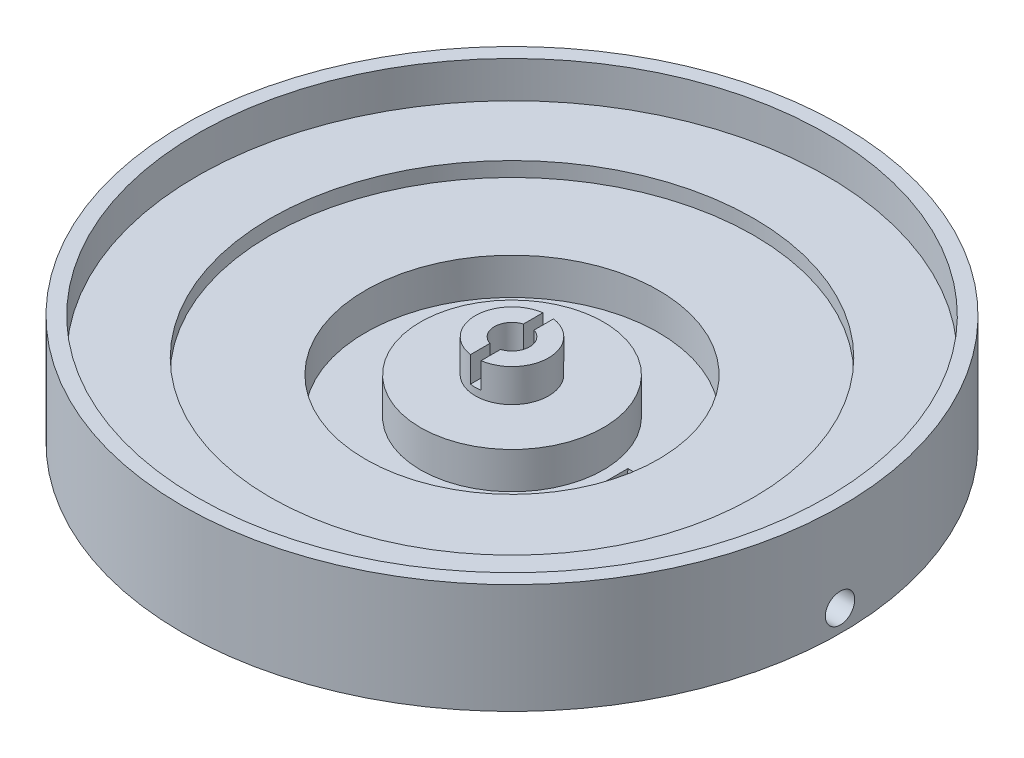
ISO-10303-21;
HEADER;
FILE_DESCRIPTION(('STEP AP214'),'2;1');
FILE_NAME('part.step','',(''),(''),'','','');
FILE_SCHEMA(('AUTOMOTIVE_DESIGN { 1 0 10303 214 1 1 1 1 }'));
ENDSEC;
DATA;
#1=APPLICATION_CONTEXT('core data for automotive mechanical design processes');
#2=APPLICATION_PROTOCOL_DEFINITION('international standard','automotive_design',2000,#1);
#3=PRODUCT_CONTEXT('',#1,'mechanical');
#4=PRODUCT('Part','Part','',(#3));
#5=PRODUCT_RELATED_PRODUCT_CATEGORY('part','',(#4));
#6=PRODUCT_DEFINITION_FORMATION('','',#4);
#7=PRODUCT_DEFINITION_CONTEXT('part definition',#1,'design');
#8=PRODUCT_DEFINITION('design','',#6,#7);
#9=PRODUCT_DEFINITION_SHAPE('','',#8);
#10=(LENGTH_UNIT() NAMED_UNIT(*) SI_UNIT(.MILLI.,.METRE.));
#11=(NAMED_UNIT(*) PLANE_ANGLE_UNIT() SI_UNIT($,.RADIAN.));
#12=(NAMED_UNIT(*) SI_UNIT($,.STERADIAN.) SOLID_ANGLE_UNIT());
#13=UNCERTAINTY_MEASURE_WITH_UNIT(LENGTH_MEASURE(1.E-05),#10,'distance_accuracy_value','');
#14=(GEOMETRIC_REPRESENTATION_CONTEXT(3) GLOBAL_UNCERTAINTY_ASSIGNED_CONTEXT((#13)) GLOBAL_UNIT_ASSIGNED_CONTEXT((#10,
#11,#12)) REPRESENTATION_CONTEXT('',''));
#15=CARTESIAN_POINT('',(0.,0.,0.));
#16=DIRECTION('',(0.,0.,1.));
#17=DIRECTION('',(1.,0.,0.));
#18=AXIS2_PLACEMENT_3D('',#15,#16,#17);
#19=CARTESIAN_POINT('',(0.,8.,0.));
#20=DIRECTION('',(0.,-1.,0.));
#21=DIRECTION('',(0.,0.,-1.));
#22=AXIS2_PLACEMENT_3D('',#19,#20,#21);
#23=CYLINDRICAL_SURFACE('',#22,3.5);
#24=CARTESIAN_POINT('',(0.,8.,0.));
#25=DIRECTION('',(0.,-1.,0.));
#26=DIRECTION('',(0.,0.,-1.));
#27=AXIS2_PLACEMENT_3D('',#24,#25,#26);
#28=CIRCLE('',#27,3.5);
#29=CARTESIAN_POINT('',(0.,8.,-3.5));
#30=VERTEX_POINT('',#29);
#31=EDGE_CURVE('E261',#30,#30,#28,.T.);
#32=ORIENTED_EDGE('',*,*,#31,.F.);
#33=EDGE_LOOP('',(#32));
#34=FACE_BOUND('',#33,.T.);
#35=CARTESIAN_POINT('',(0.,6.,0.));
#36=DIRECTION('',(0.,-1.,0.));
#37=DIRECTION('',(0.,0.,-1.));
#38=AXIS2_PLACEMENT_3D('',#35,#36,#37);
#39=CIRCLE('',#38,3.5);
#40=CARTESIAN_POINT('',(0.,6.,-3.5));
#41=VERTEX_POINT('',#40);
#42=EDGE_CURVE('E78',#41,#41,#39,.F.);
#43=ORIENTED_EDGE('',*,*,#42,.F.);
#44=EDGE_LOOP('',(#43));
#45=FACE_BOUND('',#44,.T.);
#46=ADVANCED_FACE('F73',(#34,#45),#23,.F.);
#47=CARTESIAN_POINT('',(0.,8.,0.));
#48=DIRECTION('',(0.,1.,0.));
#49=DIRECTION('',(0.,0.,1.));
#50=AXIS2_PLACEMENT_3D('',#47,#48,#49);
#51=PLANE('',#50);
#52=CARTESIAN_POINT('',(0.,8.,0.));
#53=DIRECTION('',(0.,1.,0.));
#54=DIRECTION('',(0.,0.,1.));
#55=AXIS2_PLACEMENT_3D('',#52,#53,#54);
#56=CIRCLE('',#55,5.);
#57=CARTESIAN_POINT('',(0.,8.,5.));
#58=VERTEX_POINT('',#57);
#59=EDGE_CURVE('E297',#58,#58,#56,.T.);
#60=ORIENTED_EDGE('',*,*,#59,.F.);
#61=EDGE_LOOP('',(#60));
#62=FACE_BOUND('',#61,.T.);
#63=CARTESIAN_POINT('',(0.,8.,0.));
#64=DIRECTION('',(0.,1.,0.));
#65=DIRECTION('',(0.,0.,1.));
#66=AXIS2_PLACEMENT_3D('',#63,#64,#65);
#67=CIRCLE('',#66,12.5);
#68=CARTESIAN_POINT('',(0.,8.,12.5));
#69=VERTEX_POINT('',#68);
#70=EDGE_CURVE('E248',#69,#69,#67,.T.);
#71=ORIENTED_EDGE('',*,*,#70,.T.);
#72=EDGE_LOOP('',(#71));
#73=FACE_BOUND('',#72,.T.);
#74=ADVANCED_FACE('F357',(#62,#73),#51,.T.);
#75=CARTESIAN_POINT('',(14.,3.,0.169435032227064));
#76=DIRECTION('',(1.,0.,0.));
#77=DIRECTION('',(0.,0.,-1.));
#78=AXIS2_PLACEMENT_3D('',#75,#76,#77);
#79=CYLINDRICAL_SURFACE('',#78,2.);
#80=CARTESIAN_POINT('',(44.9627516050649,3.,-1.83056496777294));
#81=CARTESIAN_POINT('',(44.9627521844356,2.88770721849648,-1.83056000924637));
#82=CARTESIAN_POINT('',(44.9631410368531,2.77533443604274,-1.82107598620608));
#83=CARTESIAN_POINT('',(44.9646518101755,2.55368742660685,-1.78337594847323));
#84=CARTESIAN_POINT('',(44.9657745986403,2.44441702654294,-1.75513776451586));
#85=CARTESIAN_POINT('',(44.9686168213901,2.23221737006654,-1.68073765760939));
#86=CARTESIAN_POINT('',(44.9703359583178,2.12928498339277,-1.63458466616237));
#87=CARTESIAN_POINT('',(44.9741621492641,1.93265669403164,-1.52567801021975));
#88=CARTESIAN_POINT('',(44.9762691104185,1.83895858843481,-1.46292831821805));
#89=CARTESIAN_POINT('',(44.9806153880045,1.66336244184256,-1.32255751387651));
#90=CARTESIAN_POINT('',(44.9828547867368,1.58147184939349,-1.24492708560136));
#91=CARTESIAN_POINT('',(44.9871878941077,1.43187902361618,-1.07701607004938));
#92=CARTESIAN_POINT('',(44.9892815969643,1.36417735317306,-0.986734981148399));
#93=CARTESIAN_POINT('',(44.9930591772505,1.24487169847871,-0.796057431479764));
#94=CARTESIAN_POINT('',(44.9947429484514,1.19327188585222,-0.695658358270902));
#95=CARTESIAN_POINT('',(44.9974782004117,1.10766290188144,-0.487613671628479));
#96=CARTESIAN_POINT('',(44.9985296853778,1.07365361350467,-0.37996810641233));
#97=CARTESIAN_POINT('',(44.9998471017061,1.0242122763859,-0.160564690518811));
#98=CARTESIAN_POINT('',(45.0001135689882,1.00876755815553,-0.0488096980810066));
#99=CARTESIAN_POINT('',(44.99979697232,0.996853024195305,0.17570554744773));
#100=CARTESIAN_POINT('',(44.9992139133921,1.00038309628529,0.288465794591599));
#101=CARTESIAN_POINT('',(44.997228792836,1.02630768863082,0.511721823710563));
#102=CARTESIAN_POINT('',(44.9958272091822,1.04869120285979,0.622218888317617));
#103=CARTESIAN_POINT('',(44.9923281202319,1.11166858215332,0.837883988471496));
#104=CARTESIAN_POINT('',(44.9902306118054,1.15226252912231,0.943052000047658));
#105=CARTESIAN_POINT('',(44.9855410263286,1.25053078136477,1.14513336936929));
#106=CARTESIAN_POINT('',(44.9829487003817,1.30821369060147,1.24204253722168));
#107=CARTESIAN_POINT('',(44.9775310487958,1.43901605559427,1.42480640943221));
#108=CARTESIAN_POINT('',(44.9747057217947,1.51213560160573,1.51066104915172));
#109=CARTESIAN_POINT('',(44.9691101498771,1.67181450243221,1.66895944317278));
#110=CARTESIAN_POINT('',(44.96633995672,1.75838587105047,1.74139108137324));
#111=CARTESIAN_POINT('',(44.9611466447805,1.94246905710119,1.87069329604537));
#112=CARTESIAN_POINT('',(44.9587235258649,2.03998087033635,1.92756387848701));
#113=CARTESIAN_POINT('',(44.9544800698466,2.24317206607451,2.02412173071443));
#114=CARTESIAN_POINT('',(44.9526596780583,2.34885070652629,2.06381055950403));
#115=CARTESIAN_POINT('',(44.949814594564,2.56538211848094,2.12487893470405));
#116=CARTESIAN_POINT('',(44.9487898973155,2.67623485393715,2.14625860864979));
#117=CARTESIAN_POINT('',(44.9476459618274,2.89984726926115,2.17008472996042));
#118=CARTESIAN_POINT('',(44.9475258057375,3.01260489969546,2.17255036970376));
#119=CARTESIAN_POINT('',(44.9482013221005,3.23693237932741,2.1585285002086));
#120=CARTESIAN_POINT('',(44.9489969917379,3.34850223217565,2.14204104923887));
#121=CARTESIAN_POINT('',(44.9514189144983,3.56723542095037,2.09059641365376));
#122=CARTESIAN_POINT('',(44.9530447889446,3.67440074183322,2.05564764944396));
#123=CARTESIAN_POINT('',(44.9569546339036,3.88134389397537,1.9682812514678));
#124=CARTESIAN_POINT('',(44.9592386077369,3.98112168795642,1.91586352955853));
#125=CARTESIAN_POINT('',(44.9642260283797,4.17054286938275,1.79499995724312));
#126=CARTESIAN_POINT('',(44.9669298006415,4.26017829987752,1.72654165010182));
#127=CARTESIAN_POINT('',(44.9724727563101,4.42669076820309,1.57555884936634));
#128=CARTESIAN_POINT('',(44.9753119405479,4.5035677277437,1.49303426946318));
#129=CARTESIAN_POINT('',(44.9808347862849,4.64244816934428,1.31617665900249));
#130=CARTESIAN_POINT('',(44.9835183117289,4.70443878410477,1.221833519246));
#131=CARTESIAN_POINT('',(44.9884546938945,4.81169988800983,1.02406796562595));
#132=CARTESIAN_POINT('',(44.99070755194,4.85697042855479,0.920645579674783));
#133=CARTESIAN_POINT('',(44.9945608713145,4.92949052758417,0.707686942080634));
#134=CARTESIAN_POINT('',(44.9961615256659,4.95674541936433,0.598152510250543));
#135=CARTESIAN_POINT('',(44.9985656646562,4.99247575087053,0.376053802634538));
#136=CARTESIAN_POINT('',(44.9993691528429,5.00095127417153,0.263489540334721));
#137=CARTESIAN_POINT('',(45.0001237235958,4.99887998635246,0.0386395613263196));
#138=CARTESIAN_POINT('',(45.0000756071683,4.98835105889617,-0.0736463177890762));
#139=CARTESIAN_POINT('',(44.9991699750476,4.94860500110541,-0.294856914974606));
#140=CARTESIAN_POINT('',(44.9983124585676,4.91938785260391,-0.403781629777206));
#141=CARTESIAN_POINT('',(44.9959193065053,4.84310309349192,-0.615163418648156));
#142=CARTESIAN_POINT('',(44.9943837693866,4.79603807492855,-0.717621429357153));
#143=CARTESIAN_POINT('',(44.990839901754,4.68539626699545,-0.913182317481473));
#144=CARTESIAN_POINT('',(44.9888315869116,4.62182002492781,-1.00628550484187));
#145=CARTESIAN_POINT('',(44.9845960474417,4.47991018228086,-1.18056605593316));
#146=CARTESIAN_POINT('',(44.9823686778353,4.40156677636427,-1.26173543155099));
#147=CARTESIAN_POINT('',(44.9779721703583,4.23234462299078,-1.4097949325305));
#148=CARTESIAN_POINT('',(44.9758030469927,4.14146278706665,-1.47668152938277));
#149=CARTESIAN_POINT('',(44.9717874513211,3.94967856066974,-1.59430586426639));
#150=CARTESIAN_POINT('',(44.9699412766221,3.84876706042269,-1.64502874193036));
#151=CARTESIAN_POINT('',(44.9668009259404,3.63992965905656,-1.72875282385481));
#152=CARTESIAN_POINT('',(44.965506097004,3.53201223061563,-1.76177500295848));
#153=CARTESIAN_POINT('',(44.9639689681013,3.35285105983876,-1.80047293748952));
#154=CARTESIAN_POINT('',(44.9635145923362,3.28276790268187,-1.81174312314793));
#155=CARTESIAN_POINT('',(44.9629057279559,3.1418004656299,-1.82679070195066));
#156=CARTESIAN_POINT('',(44.9627512391753,3.07091618617672,-1.83056809922795));
#157=CARTESIAN_POINT('',(44.9627516050649,3.,-1.83056496777294));
#158=B_SPLINE_CURVE_WITH_KNOTS('',3,(#80,#81,#82,#83,#84,#85,#86,#87,#88,#89,#90,#91,#92,#93,
#94,#95,#96,#97,#98,#99,#100,#101,#102,#103,#104,#105,#106,#107,#108,#109,#110,#111,#112,#113,
#114,#115,#116,#117,#118,#119,#120,#121,#122,#123,#124,#125,#126,#127,#128,#129,#130,#131,#132,
#133,#134,#135,#136,#137,#138,#139,#140,#141,#142,#143,#144,#145,#146,#147,#148,#149,#150,#151,
#152,#153,#154,#155,#156,#157),.UNSPECIFIED.,.T.,.F.,(4,2,2,2,2,2,2,2,2,2,2,2,2,2,2,2,2,2,2,2,2,
2,2,2,2,2,2,2,2,2,2,2,2,2,2,2,2,2,4),(0.,0.336619507858614,0.673637643057471,1.0104879718192,
1.34725774681024,1.6842390457941,2.02123371054784,2.35831561059902,2.69539526796363,
3.03224475269849,3.36909224596016,3.70574323478291,4.04239573776423,4.37921802768874,
4.71604228700955,5.05316911116588,5.39029580598402,5.72739190485566,6.06448565561207,
6.40123730654672,6.7379879221858,7.07458507466419,7.41118392553244,7.74804504246812,
8.0849082264184,8.42206154486176,8.75921382682906,9.09626625454611,9.4333171822551,
9.77005110194738,10.106785348983,10.4434707108034,10.780144913845,11.1170434597583,
11.4540251392077,11.7913157401402,12.1282057723966,12.3407909852473,12.5533760808375),.UNSPECIFIED.);
#159=CARTESIAN_POINT('',(44.9627516050649,3.,-1.83056496777294));
#160=VERTEX_POINT('',#159);
#161=EDGE_CURVE('E339',#160,#160,#158,.T.);
#162=ORIENTED_EDGE('',*,*,#161,.F.);
#163=EDGE_LOOP('',(#162));
#164=FACE_BOUND('',#163,.T.);
#165=DIRECTION('',(1.,0.,0.));
#166=VECTOR('',#165,1.);
#167=CARTESIAN_POINT('',(14.,3.,2.16943503222706));
#168=LINE('',#167,#166);
#169=CARTESIAN_POINT('',(19.8819906357725,3.,2.16943503222706));
#170=VERTEX_POINT('',#169);
#171=CARTESIAN_POINT('',(14.,3.,2.16943503222706));
#172=VERTEX_POINT('',#171);
#173=EDGE_CURVE('E98',#170,#172,#168,.F.);
#174=ORIENTED_EDGE('',*,*,#173,.F.);
#175=CARTESIAN_POINT('',(19.8819906357725,3.,2.16943503222706));
#176=CARTESIAN_POINT('',(19.8819892789072,3.05608740823063,2.16943485440143));
#177=CARTESIAN_POINT('',(19.8822483926916,3.11214778984579,2.16707419882754));
#178=CARTESIAN_POINT('',(19.8832730116102,3.22386425947614,2.15765786804081));
#179=CARTESIAN_POINT('',(19.8840384818,3.27952037512239,2.15060251681564));
#180=CARTESIAN_POINT('',(19.8870689538562,3.44516608636769,2.12246723696375));
#181=CARTESIAN_POINT('',(19.89006812203,3.55404110290478,2.09441786129539));
#182=CARTESIAN_POINT('',(19.8977082278834,3.76549820428689,2.02053695216046));
#183=CARTESIAN_POINT('',(19.902349763324,3.86807798192478,1.97469894369954));
#184=CARTESIAN_POINT('',(19.912782264643,4.06409179568341,1.86655887087041));
#185=CARTESIAN_POINT('',(19.9185731039906,4.15752683688857,1.80425861863402));
#186=CARTESIAN_POINT('',(19.9307226066604,4.33297195781196,1.6646938631066));
#187=CARTESIAN_POINT('',(19.9370832629561,4.41493914773345,1.58737563753133));
#188=CARTESIAN_POINT('',(19.9496969025861,4.5647705728797,1.42007644383313));
#189=CARTESIAN_POINT('',(19.9559498690457,4.63263261595927,1.33009351106944));
#190=CARTESIAN_POINT('',(19.9677278973673,4.75249690213884,1.13971490196343));
#191=CARTESIAN_POINT('',(19.9732508394085,4.80445351056562,1.03929035146819));
#192=CARTESIAN_POINT('',(19.9829964818175,4.89074537258654,0.831083945480119));
#193=CARTESIAN_POINT('',(19.9872192897417,4.92508208398091,0.723302699487294));
#194=CARTESIAN_POINT('',(19.9939540454447,4.97505181860332,0.503799132361767));
#195=CARTESIAN_POINT('',(19.9964714251365,4.99074434643943,0.392090527455309));
#196=CARTESIAN_POINT('',(19.9996127643396,5.00315598940216,0.167596446158436));
#197=CARTESIAN_POINT('',(20.0002367329595,4.99987519580468,0.0548109749511628));
#198=CARTESIAN_POINT('',(19.9996027403304,4.9744827274692,-0.168134798854894));
#199=CARTESIAN_POINT('',(19.9983526225659,4.95244970175148,-0.27830409319248));
#200=CARTESIAN_POINT('',(19.9942029609698,4.89029244659186,-0.493381010432813));
#201=CARTESIAN_POINT('',(19.9913034117715,4.85016815828789,-0.598288616214796));
#202=CARTESIAN_POINT('',(19.9842492228229,4.75292827521199,-0.799993041231722));
#203=CARTESIAN_POINT('',(19.9800933055148,4.69579538587957,-0.896781475771645));
#204=CARTESIAN_POINT('',(19.971059733648,4.56617417718049,-1.07941964003369));
#205=CARTESIAN_POINT('',(19.9661820915715,4.49368612336963,-1.16526955888796));
#206=CARTESIAN_POINT('',(19.9562893970523,4.33506716409367,-1.32396133793637));
#207=CARTESIAN_POINT('',(19.9512738716865,4.24888267114263,-1.3967496078712));
#208=CARTESIAN_POINT('',(19.9417393036777,4.06546798374872,-1.52686113913849));
#209=CARTESIAN_POINT('',(19.9372204131109,3.96823442437438,-1.58417967121499));
#210=CARTESIAN_POINT('',(19.9292277069264,3.76537434614586,-1.68175271057254));
#211=CARTESIAN_POINT('',(19.9257552634406,3.65973703534842,-1.72198484169898));
#212=CARTESIAN_POINT('',(19.9202934429486,3.44324638697176,-1.78406741638091));
#213=CARTESIAN_POINT('',(19.9183018381197,3.33240115258683,-1.80594547879237));
#214=CARTESIAN_POINT('',(19.9167959658698,3.18398241871365,-1.82242824720627));
#215=CARTESIAN_POINT('',(19.9165162883377,3.14722007403512,-1.8254810394177));
#216=CARTESIAN_POINT('',(19.9161433342606,3.07364359532181,-1.82954664859042));
#217=CARTESIAN_POINT('',(19.9160497459137,3.03682965151996,-1.83056287793951));
#218=CARTESIAN_POINT('',(19.9160496057517,3.,-1.83056496777294));
#219=B_SPLINE_CURVE_WITH_KNOTS('',3,(#175,#176,#177,#178,#179,#180,#181,#182,#183,#184,#185,
#186,#187,#188,#189,#190,#191,#192,#193,#194,#195,#196,#197,#198,#199,#200,#201,#202,#203,#204,
#205,#206,#207,#208,#209,#210,#211,#212,#213,#214,#215,#216,#217,#218),.UNSPECIFIED.,.F.,.F.,(4,
2,2,2,2,2,2,2,2,2,2,2,2,2,2,2,2,2,2,2,2,4),(0.,0.168158371752695,0.336305139859055,
0.671982486252805,1.00778213269501,1.34354483035157,1.68053150595716,2.01757051510337,
2.35556765886819,2.69353683358267,3.03042442623265,3.36731039820207,3.702790355262,
4.03827140385379,4.37409474575096,4.70991228031454,5.04707760702393,5.38434589214213,
5.72205450805545,6.05925403023261,6.16988297533085,6.28032639924366),.UNSPECIFIED.);
#220=CARTESIAN_POINT('',(19.9160496057517,3.,-1.83056496777294));
#221=VERTEX_POINT('',#220);
#222=EDGE_CURVE('E12',#170,#221,#219,.T.);
#223=ORIENTED_EDGE('',*,*,#222,.T.);
#224=DIRECTION('',(1.,0.,0.));
#225=VECTOR('',#224,1.);
#226=CARTESIAN_POINT('',(14.,3.,-1.83056496777294));
#227=LINE('',#226,#225);
#228=CARTESIAN_POINT('',(14.,3.,-1.83056496777294));
#229=VERTEX_POINT('',#228);
#230=EDGE_CURVE('E253',#229,#221,#227,.T.);
#231=ORIENTED_EDGE('',*,*,#230,.F.);
#232=CARTESIAN_POINT('',(14.,3.,0.169435032227064));
#233=DIRECTION('',(1.,0.,0.));
#234=DIRECTION('',(0.,0.,-1.));
#235=AXIS2_PLACEMENT_3D('',#232,#233,#234);
#236=CIRCLE('',#235,2.);
#237=EDGE_CURVE('E258',#172,#229,#236,.T.);
#238=ORIENTED_EDGE('',*,*,#237,.F.);
#239=EDGE_LOOP('',(#174,#223,#231,#238));
#240=FACE_BOUND('',#239,.T.);
#241=ADVANCED_FACE('F351',(#164,#240),#79,.F.);
#242=CARTESIAN_POINT('',(14.,3.,0.169435032227064));
#243=DIRECTION('',(1.,0.,0.));
#244=DIRECTION('',(0.,0.,-1.));
#245=AXIS2_PLACEMENT_3D('',#242,#243,#244);
#246=PLANE('',#245);
#247=ORIENTED_EDGE('',*,*,#237,.T.);
#248=DIRECTION('',(0.,0.,1.));
#249=VECTOR('',#248,1.);
#250=CARTESIAN_POINT('',(14.,3.,0.169435032227064));
#251=LINE('',#250,#249);
#252=EDGE_CURVE('E83',#229,#172,#251,.T.);
#253=ORIENTED_EDGE('',*,*,#252,.T.);
#254=EDGE_LOOP('',(#247,#253));
#255=FACE_BOUND('',#254,.T.);
#256=ADVANCED_FACE('F356',(#255),#246,.T.);
#257=CARTESIAN_POINT('',(0.,17.,0.));
#258=DIRECTION('',(0.,-1.,0.));
#259=DIRECTION('',(0.,0.,-1.));
#260=AXIS2_PLACEMENT_3D('',#257,#258,#259);
#261=CYLINDRICAL_SURFACE('',#260,1.3);
#262=CARTESIAN_POINT('',(0.,9.,0.));
#263=DIRECTION('',(0.,1.,0.));
#264=DIRECTION('',(0.,0.,1.));
#265=AXIS2_PLACEMENT_3D('',#262,#263,#264);
#266=CIRCLE('',#265,1.3);
#267=CARTESIAN_POINT('',(0.,9.,1.3));
#268=VERTEX_POINT('',#267);
#269=EDGE_CURVE('E340',#268,#268,#266,.T.);
#270=ORIENTED_EDGE('',*,*,#269,.T.);
#271=EDGE_LOOP('',(#270));
#272=FACE_BOUND('',#271,.T.);
#273=CARTESIAN_POINT('',(0.,8.,0.));
#274=DIRECTION('',(0.,-1.,0.));
#275=DIRECTION('',(0.,0.,-1.));
#276=AXIS2_PLACEMENT_3D('',#273,#274,#275);
#277=CIRCLE('',#276,1.3);
#278=CARTESIAN_POINT('',(0.,8.,-1.3));
#279=VERTEX_POINT('',#278);
#280=EDGE_CURVE('E264',#279,#279,#277,.F.);
#281=ORIENTED_EDGE('',*,*,#280,.F.);
#282=EDGE_LOOP('',(#281));
#283=FACE_BOUND('',#282,.T.);
#284=ADVANCED_FACE('F415',(#272,#283),#261,.F.);
#285=CARTESIAN_POINT('',(0.722167452419563,9.,-5.55558175344062));
#286=DIRECTION('',(1.,0.,0.));
#287=DIRECTION('',(0.,0.,-1.));
#288=AXIS2_PLACEMENT_3D('',#285,#286,#287);
#289=PLANE('',#288);
#290=DIRECTION('',(0.,0.,-1.));
#291=VECTOR('',#290,1.);
#292=CARTESIAN_POINT('',(0.722167452419563,9.,-5.55558175344062));
#293=LINE('',#292,#291);
#294=CARTESIAN_POINT('',(0.722167452419563,9.,-2.28877132336672));
#295=VERTEX_POINT('',#294);
#296=CARTESIAN_POINT('',(0.722167452419563,9.,-4.94757255335036));
#297=VERTEX_POINT('',#296);
#298=EDGE_CURVE('E277',#295,#297,#293,.T.);
#299=ORIENTED_EDGE('',*,*,#298,.F.);
#300=DIRECTION('',(0.,1.,0.));
#301=VECTOR('',#300,1.);
#302=CARTESIAN_POINT('',(0.722167452419563,9.,-2.28877132336672));
#303=LINE('',#302,#301);
#304=CARTESIAN_POINT('',(0.722167452419563,12.5,-2.28877132336672));
#305=VERTEX_POINT('',#304);
#306=EDGE_CURVE('E274',#295,#305,#303,.T.);
#307=ORIENTED_EDGE('',*,*,#306,.T.);
#308=DIRECTION('',(0.,0.,-1.));
#309=VECTOR('',#308,1.);
#310=CARTESIAN_POINT('',(0.722167452419563,12.5,0.));
#311=LINE('',#310,#309);
#312=CARTESIAN_POINT('',(0.722167452419563,12.5,-4.94757255335036));
#313=VERTEX_POINT('',#312);
#314=EDGE_CURVE('E326',#305,#313,#311,.T.);
#315=ORIENTED_EDGE('',*,*,#314,.T.);
#316=DIRECTION('',(0.,-1.,0.));
#317=VECTOR('',#316,1.);
#318=CARTESIAN_POINT('',(0.722167452419563,12.5,-4.94757255335036));
#319=LINE('',#318,#317);
#320=EDGE_CURVE('E291',#297,#313,#319,.F.);
#321=ORIENTED_EDGE('',*,*,#320,.F.);
#322=EDGE_LOOP('',(#299,#307,#315,#321));
#323=FACE_BOUND('',#322,.T.);
#324=ADVANCED_FACE('F418',(#323),#289,.F.);
#325=CARTESIAN_POINT('',(-0.722167452419563,9.,-5.55558175344062));
#326=DIRECTION('',(-1.,0.,0.));
#327=DIRECTION('',(0.,0.,1.));
#328=AXIS2_PLACEMENT_3D('',#325,#326,#327);
#329=PLANE('',#328);
#330=DIRECTION('',(0.,0.,1.));
#331=VECTOR('',#330,1.);
#332=CARTESIAN_POINT('',(-0.722167452419563,9.,-5.55558175344062));
#333=LINE('',#332,#331);
#334=CARTESIAN_POINT('',(-0.722167452419563,9.,2.28877132336672));
#335=VERTEX_POINT('',#334);
#336=CARTESIAN_POINT('',(-0.722167452419563,9.,4.94757255335036));
#337=VERTEX_POINT('',#336);
#338=EDGE_CURVE('E281',#335,#337,#333,.T.);
#339=ORIENTED_EDGE('',*,*,#338,.F.);
#340=DIRECTION('',(0.,1.,0.));
#341=VECTOR('',#340,1.);
#342=CARTESIAN_POINT('',(-0.722167452419563,9.,2.28877132336672));
#343=LINE('',#342,#341);
#344=CARTESIAN_POINT('',(-0.722167452419563,12.5,2.28877132336672));
#345=VERTEX_POINT('',#344);
#346=EDGE_CURVE('E336',#335,#345,#343,.T.);
#347=ORIENTED_EDGE('',*,*,#346,.T.);
#348=DIRECTION('',(0.,0.,1.));
#349=VECTOR('',#348,1.);
#350=CARTESIAN_POINT('',(-0.722167452419563,12.5,0.));
#351=LINE('',#350,#349);
#352=CARTESIAN_POINT('',(-0.722167452419563,12.5,4.94757255335036));
#353=VERTEX_POINT('',#352);
#354=EDGE_CURVE('E322',#345,#353,#351,.T.);
#355=ORIENTED_EDGE('',*,*,#354,.T.);
#356=DIRECTION('',(0.,-1.,0.));
#357=VECTOR('',#356,1.);
#358=CARTESIAN_POINT('',(-0.722167452419563,12.5,4.94757255335036));
#359=LINE('',#358,#357);
#360=EDGE_CURVE('E285',#337,#353,#359,.F.);
#361=ORIENTED_EDGE('',*,*,#360,.F.);
#362=EDGE_LOOP('',(#339,#347,#355,#361));
#363=FACE_BOUND('',#362,.T.);
#364=ADVANCED_FACE('F435',(#363),#329,.F.);
#365=CARTESIAN_POINT('',(0.,12.5,0.));
#366=DIRECTION('',(0.,1.,0.));
#367=DIRECTION('',(0.,0.,1.));
#368=AXIS2_PLACEMENT_3D('',#365,#366,#367);
#369=PLANE('',#368);
#370=CARTESIAN_POINT('',(0.,12.5,0.));
#371=DIRECTION('',(0.,1.,0.));
#372=DIRECTION('',(0.,0.,1.));
#373=AXIS2_PLACEMENT_3D('',#370,#371,#372);
#374=CIRCLE('',#373,2.4);
#375=CARTESIAN_POINT('',(0.722167452419563,12.5,2.28877132336672));
#376=VERTEX_POINT('',#375);
#377=EDGE_CURVE('E269',#376,#305,#374,.T.);
#378=ORIENTED_EDGE('',*,*,#377,.F.);
#379=CARTESIAN_POINT('',(0.722167452419563,12.5,4.94757255335036));
#380=VERTEX_POINT('',#379);
#381=EDGE_CURVE('E327',#380,#376,#311,.T.);
#382=ORIENTED_EDGE('',*,*,#381,.F.);
#383=CARTESIAN_POINT('',(0.,12.5,0.));
#384=DIRECTION('',(0.,1.,0.));
#385=DIRECTION('',(0.,0.,1.));
#386=AXIS2_PLACEMENT_3D('',#383,#384,#385);
#387=CIRCLE('',#386,5.);
#388=EDGE_CURVE('E298',#380,#313,#387,.T.);
#389=ORIENTED_EDGE('',*,*,#388,.T.);
#390=ORIENTED_EDGE('',*,*,#314,.F.);
#391=EDGE_LOOP('',(#378,#382,#389,#390));
#392=FACE_BOUND('',#391,.T.);
#393=ADVANCED_FACE('F443',(#392),#369,.T.);
#394=CARTESIAN_POINT('',(0.,15.,0.));
#395=DIRECTION('',(0.,-1.,0.));
#396=DIRECTION('',(0.,0.,-1.));
#397=AXIS2_PLACEMENT_3D('',#394,#395,#396);
#398=CYLINDRICAL_SURFACE('',#397,45.);
#399=ORIENTED_EDGE('',*,*,#161,.T.);
#400=EDGE_LOOP('',(#399));
#401=FACE_BOUND('',#400,.T.);
#402=CARTESIAN_POINT('',(0.,15.,0.));
#403=DIRECTION('',(0.,1.,0.));
#404=DIRECTION('',(0.,0.,1.));
#405=AXIS2_PLACEMENT_3D('',#402,#403,#404);
#406=CIRCLE('',#405,45.);
#407=CARTESIAN_POINT('',(0.,15.,45.));
#408=VERTEX_POINT('',#407);
#409=EDGE_CURVE('E314',#408,#408,#406,.T.);
#410=ORIENTED_EDGE('',*,*,#409,.F.);
#411=EDGE_LOOP('',(#410));
#412=FACE_BOUND('',#411,.T.);
#413=CARTESIAN_POINT('',(0.,0.,0.));
#414=DIRECTION('',(0.,1.,0.));
#415=DIRECTION('',(0.,0.,1.));
#416=AXIS2_PLACEMENT_3D('',#413,#414,#415);
#417=CIRCLE('',#416,45.);
#418=CARTESIAN_POINT('',(0.,0.,45.));
#419=VERTEX_POINT('',#418);
#420=EDGE_CURVE('E313',#419,#419,#417,.T.);
#421=ORIENTED_EDGE('',*,*,#420,.T.);
#422=EDGE_LOOP('',(#421));
#423=FACE_BOUND('',#422,.T.);
#424=ADVANCED_FACE('F75',(#401,#412,#423),#398,.T.);
#425=CARTESIAN_POINT('',(0.,15.,0.));
#426=DIRECTION('',(0.,1.,0.));
#427=DIRECTION('',(0.,0.,1.));
#428=AXIS2_PLACEMENT_3D('',#425,#426,#427);
#429=PLANE('',#428);
#430=CARTESIAN_POINT('',(0.,15.,0.));
#431=DIRECTION('',(0.,1.,0.));
#432=DIRECTION('',(0.,0.,1.));
#433=AXIS2_PLACEMENT_3D('',#430,#431,#432);
#434=CIRCLE('',#433,43.);
#435=CARTESIAN_POINT('',(0.,15.,43.));
#436=VERTEX_POINT('',#435);
#437=EDGE_CURVE('E308',#436,#436,#434,.T.);
#438=ORIENTED_EDGE('',*,*,#437,.F.);
#439=EDGE_LOOP('',(#438));
#440=FACE_BOUND('',#439,.T.);
#441=ORIENTED_EDGE('',*,*,#409,.T.);
#442=EDGE_LOOP('',(#441));
#443=FACE_BOUND('',#442,.T.);
#444=ADVANCED_FACE('F462',(#440,#443),#429,.T.);
#445=CARTESIAN_POINT('',(0.,0.,0.));
#446=DIRECTION('',(0.,1.,0.));
#447=DIRECTION('',(0.,0.,1.));
#448=AXIS2_PLACEMENT_3D('',#445,#446,#447);
#449=PLANE('',#448);
#450=DIRECTION('',(0.563390498792022,0.,0.826190744241835));
#451=VECTOR('',#450,1.);
#452=CARTESIAN_POINT('',(2.86274115852227,0.,-5.94583997928826));
#453=LINE('',#452,#451);
#454=CARTESIAN_POINT('',(2.86274115852227,0.,-5.94583997928826));
#455=VERTEX_POINT('',#454);
#456=CARTESIAN_POINT('',(6.58061904816191,0.,-0.493713421904556));
#457=VERTEX_POINT('',#456);
#458=EDGE_CURVE('E225',#455,#457,#453,.T.);
#459=ORIENTED_EDGE('',*,*,#458,.F.);
#460=DIRECTION('',(0.997197422281012,0.,-0.0748151120837596));
#461=VECTOR('',#460,1.);
#462=CARTESIAN_POINT('',(-3.71787788963964,0.,-5.45212655738371));
#463=LINE('',#462,#461);
#464=CARTESIAN_POINT('',(-3.71787788963964,0.,-5.45212655738371));
#465=VERTEX_POINT('',#464);
#466=EDGE_CURVE('E90',#465,#455,#463,.T.);
#467=ORIENTED_EDGE('',*,*,#466,.F.);
#468=DIRECTION('',(0.43380692348899,0.,-0.901005856325594));
#469=VECTOR('',#468,1.);
#470=CARTESIAN_POINT('',(-6.58061904816191,0.,0.493713421904559));
#471=LINE('',#470,#469);
#472=CARTESIAN_POINT('',(-6.58061904816191,0.,0.493713421904559));
#473=VERTEX_POINT('',#472);
#474=EDGE_CURVE('E211',#473,#465,#471,.T.);
#475=ORIENTED_EDGE('',*,*,#474,.F.);
#476=DIRECTION('',(-0.563390498792022,0.,-0.826190744241835));
#477=VECTOR('',#476,1.);
#478=CARTESIAN_POINT('',(-2.86274115852228,0.,5.94583997928826));
#479=LINE('',#478,#477);
#480=CARTESIAN_POINT('',(-2.86274115852228,0.,5.94583997928826));
#481=VERTEX_POINT('',#480);
#482=EDGE_CURVE('E214',#481,#473,#479,.T.);
#483=ORIENTED_EDGE('',*,*,#482,.F.);
#484=DIRECTION('',(-0.997197422281012,0.,0.0748151120837598));
#485=VECTOR('',#484,1.);
#486=CARTESIAN_POINT('',(3.71787788963964,0.,5.4521265573837));
#487=LINE('',#486,#485);
#488=CARTESIAN_POINT('',(3.71787788963964,0.,5.4521265573837));
#489=VERTEX_POINT('',#488);
#490=EDGE_CURVE('E230',#489,#481,#487,.T.);
#491=ORIENTED_EDGE('',*,*,#490,.F.);
#492=DIRECTION('',(-0.43380692348899,0.,0.901005856325594));
#493=VECTOR('',#492,1.);
#494=CARTESIAN_POINT('',(6.58061904816191,0.,-0.493713421904556));
#495=LINE('',#494,#493);
#496=EDGE_CURVE('E227',#457,#489,#495,.T.);
#497=ORIENTED_EDGE('',*,*,#496,.F.);
#498=EDGE_LOOP('',(#459,#467,#475,#483,#491,#497));
#499=FACE_BOUND('',#498,.T.);
#500=ORIENTED_EDGE('',*,*,#420,.F.);
#501=EDGE_LOOP('',(#500));
#502=FACE_BOUND('',#501,.T.);
#503=ADVANCED_FACE('F460',(#499,#502),#449,.F.);
#504=CARTESIAN_POINT('',(0.,15.,0.));
#505=DIRECTION('',(0.,-1.,0.));
#506=DIRECTION('',(0.,0.,-1.));
#507=AXIS2_PLACEMENT_3D('',#504,#505,#506);
#508=CYLINDRICAL_SURFACE('',#507,43.);
#509=CARTESIAN_POINT('',(0.,10.,0.));
#510=DIRECTION('',(0.,1.,0.));
#511=DIRECTION('',(0.,0.,1.));
#512=AXIS2_PLACEMENT_3D('',#509,#510,#511);
#513=CIRCLE('',#512,43.);
#514=CARTESIAN_POINT('',(0.,10.,43.));
#515=VERTEX_POINT('',#514);
#516=EDGE_CURVE('E317',#515,#515,#513,.T.);
#517=ORIENTED_EDGE('',*,*,#516,.F.);
#518=EDGE_LOOP('',(#517));
#519=FACE_BOUND('',#518,.T.);
#520=ORIENTED_EDGE('',*,*,#437,.T.);
#521=EDGE_LOOP('',(#520));
#522=FACE_BOUND('',#521,.T.);
#523=ADVANCED_FACE('F456',(#519,#522),#508,.F.);
#524=CARTESIAN_POINT('',(0.,10.,-0.514084805953665));
#525=DIRECTION('',(0.,1.,0.));
#526=DIRECTION('',(0.,0.,1.));
#527=AXIS2_PLACEMENT_3D('',#524,#525,#526);
#528=PLANE('',#527);
#529=CARTESIAN_POINT('',(0.,10.,0.));
#530=DIRECTION('',(0.,1.,0.));
#531=DIRECTION('',(0.,0.,1.));
#532=AXIS2_PLACEMENT_3D('',#529,#530,#531);
#533=CIRCLE('',#532,33.);
#534=CARTESIAN_POINT('',(0.,10.,33.));
#535=VERTEX_POINT('',#534);
#536=EDGE_CURVE('E301',#535,#535,#533,.T.);
#537=ORIENTED_EDGE('',*,*,#536,.F.);
#538=EDGE_LOOP('',(#537));
#539=FACE_BOUND('',#538,.T.);
#540=ORIENTED_EDGE('',*,*,#516,.T.);
#541=EDGE_LOOP('',(#540));
#542=FACE_BOUND('',#541,.T.);
#543=ADVANCED_FACE('F452',(#539,#542),#528,.T.);
#544=CARTESIAN_POINT('',(0.,8.,0.));
#545=DIRECTION('',(0.,1.,0.));
#546=DIRECTION('',(0.,0.,1.));
#547=AXIS2_PLACEMENT_3D('',#544,#545,#546);
#548=CYLINDRICAL_SURFACE('',#547,33.);
#549=CARTESIAN_POINT('',(0.,8.,0.));
#550=DIRECTION('',(0.,1.,0.));
#551=DIRECTION('',(0.,0.,1.));
#552=AXIS2_PLACEMENT_3D('',#549,#550,#551);
#553=CIRCLE('',#552,33.);
#554=CARTESIAN_POINT('',(0.,8.,33.));
#555=VERTEX_POINT('',#554);
#556=EDGE_CURVE('E305',#555,#555,#553,.T.);
#557=ORIENTED_EDGE('',*,*,#556,.F.);
#558=EDGE_LOOP('',(#557));
#559=FACE_BOUND('',#558,.T.);
#560=ORIENTED_EDGE('',*,*,#536,.T.);
#561=EDGE_LOOP('',(#560));
#562=FACE_BOUND('',#561,.T.);
#563=ADVANCED_FACE('F448',(#559,#562),#548,.F.);
#564=CARTESIAN_POINT('',(0.,8.,0.));
#565=DIRECTION('',(0.,1.,0.));
#566=DIRECTION('',(0.,0.,1.));
#567=AXIS2_PLACEMENT_3D('',#564,#565,#566);
#568=CIRCLE('',#567,20.);
#569=CARTESIAN_POINT('',(0.,8.,20.));
#570=VERTEX_POINT('',#569);
#571=EDGE_CURVE('E247',#570,#570,#568,.T.);
#572=ORIENTED_EDGE('',*,*,#571,.F.);
#573=EDGE_LOOP('',(#572));
#574=FACE_BOUND('',#573,.T.);
#575=ORIENTED_EDGE('',*,*,#556,.T.);
#576=EDGE_LOOP('',(#575));
#577=FACE_BOUND('',#576,.T.);
#578=ADVANCED_FACE('F411',(#574,#577),#51,.T.);
#579=CARTESIAN_POINT('',(0.,12.5,0.));
#580=DIRECTION('',(0.,-1.,0.));
#581=DIRECTION('',(0.,0.,-1.));
#582=AXIS2_PLACEMENT_3D('',#579,#580,#581);
#583=CYLINDRICAL_SURFACE('',#582,5.);
#584=CARTESIAN_POINT('',(0.,9.,0.));
#585=DIRECTION('',(0.,1.,0.));
#586=DIRECTION('',(0.,0.,1.));
#587=AXIS2_PLACEMENT_3D('',#584,#585,#586);
#588=CIRCLE('',#587,5.);
#589=CARTESIAN_POINT('',(-0.722167452419563,9.,-4.94757255335036));
#590=VERTEX_POINT('',#589);
#591=EDGE_CURVE('E332',#297,#590,#588,.T.);
#592=ORIENTED_EDGE('',*,*,#591,.F.);
#593=ORIENTED_EDGE('',*,*,#320,.T.);
#594=ORIENTED_EDGE('',*,*,#388,.F.);
#595=DIRECTION('',(0.,-1.,0.));
#596=VECTOR('',#595,1.);
#597=CARTESIAN_POINT('',(0.722167452419563,12.5,4.94757255335036));
#598=LINE('',#597,#596);
#599=CARTESIAN_POINT('',(0.722167452419563,9.,4.94757255335036));
#600=VERTEX_POINT('',#599);
#601=EDGE_CURVE('E294',#380,#600,#598,.T.);
#602=ORIENTED_EDGE('',*,*,#601,.T.);
#603=EDGE_CURVE('E330',#337,#600,#588,.T.);
#604=ORIENTED_EDGE('',*,*,#603,.F.);
#605=ORIENTED_EDGE('',*,*,#360,.T.);
#606=CARTESIAN_POINT('',(-0.722167452419563,12.5,-4.94757255335036));
#607=VERTEX_POINT('',#606);
#608=EDGE_CURVE('E302',#607,#353,#387,.T.);
#609=ORIENTED_EDGE('',*,*,#608,.F.);
#610=DIRECTION('',(0.,-1.,0.));
#611=VECTOR('',#610,1.);
#612=CARTESIAN_POINT('',(-0.722167452419563,12.5,-4.94757255335036));
#613=LINE('',#612,#611);
#614=EDGE_CURVE('E288',#607,#590,#613,.T.);
#615=ORIENTED_EDGE('',*,*,#614,.T.);
#616=EDGE_LOOP('',(#592,#593,#594,#602,#604,#605,#609,#615));
#617=FACE_BOUND('',#616,.T.);
#618=ORIENTED_EDGE('',*,*,#59,.T.);
#619=EDGE_LOOP('',(#618));
#620=FACE_BOUND('',#619,.T.);
#621=ADVANCED_FACE('F441',(#617,#620),#583,.T.);
#622=CARTESIAN_POINT('',(-0.722167452419563,12.5,-2.28877132336672));
#623=VERTEX_POINT('',#622);
#624=EDGE_CURVE('E271',#623,#345,#374,.T.);
#625=ORIENTED_EDGE('',*,*,#624,.F.);
#626=EDGE_CURVE('E323',#607,#623,#351,.T.);
#627=ORIENTED_EDGE('',*,*,#626,.F.);
#628=ORIENTED_EDGE('',*,*,#608,.T.);
#629=ORIENTED_EDGE('',*,*,#354,.F.);
#630=EDGE_LOOP('',(#625,#627,#628,#629));
#631=FACE_BOUND('',#630,.T.);
#632=ADVANCED_FACE('F429',(#631),#369,.T.);
#633=CARTESIAN_POINT('',(0.,9.,0.));
#634=DIRECTION('',(0.,1.,0.));
#635=DIRECTION('',(0.,0.,1.));
#636=AXIS2_PLACEMENT_3D('',#633,#634,#635);
#637=PLANE('',#636);
#638=ORIENTED_EDGE('',*,*,#269,.F.);
#639=EDGE_LOOP('',(#638));
#640=FACE_BOUND('',#639,.T.);
#641=CARTESIAN_POINT('',(0.722167452419563,9.,2.28877132336672));
#642=VERTEX_POINT('',#641);
#643=EDGE_CURVE('E278',#600,#642,#293,.T.);
#644=ORIENTED_EDGE('',*,*,#643,.T.);
#645=CARTESIAN_POINT('',(0.,9.,0.));
#646=DIRECTION('',(0.,1.,0.));
#647=DIRECTION('',(0.,0.,1.));
#648=AXIS2_PLACEMENT_3D('',#645,#646,#647);
#649=CIRCLE('',#648,2.4);
#650=EDGE_CURVE('E265',#642,#295,#649,.T.);
#651=ORIENTED_EDGE('',*,*,#650,.T.);
#652=ORIENTED_EDGE('',*,*,#298,.T.);
#653=ORIENTED_EDGE('',*,*,#591,.T.);
#654=CARTESIAN_POINT('',(-0.722167452419563,9.,-2.28877132336672));
#655=VERTEX_POINT('',#654);
#656=EDGE_CURVE('E282',#590,#655,#333,.T.);
#657=ORIENTED_EDGE('',*,*,#656,.T.);
#658=EDGE_CURVE('E268',#655,#335,#649,.T.);
#659=ORIENTED_EDGE('',*,*,#658,.T.);
#660=ORIENTED_EDGE('',*,*,#338,.T.);
#661=ORIENTED_EDGE('',*,*,#603,.T.);
#662=EDGE_LOOP('',(#644,#651,#652,#653,#657,#659,#660,#661));
#663=FACE_BOUND('',#662,.T.);
#664=ADVANCED_FACE('F425',(#640,#663),#637,.T.);
#665=ORIENTED_EDGE('',*,*,#381,.T.);
#666=DIRECTION('',(0.,1.,0.));
#667=VECTOR('',#666,1.);
#668=CARTESIAN_POINT('',(0.722167452419563,9.,2.28877132336672));
#669=LINE('',#668,#667);
#670=EDGE_CURVE('E267',#376,#642,#669,.F.);
#671=ORIENTED_EDGE('',*,*,#670,.T.);
#672=ORIENTED_EDGE('',*,*,#643,.F.);
#673=ORIENTED_EDGE('',*,*,#601,.F.);
#674=EDGE_LOOP('',(#665,#671,#672,#673));
#675=FACE_BOUND('',#674,.T.);
#676=ADVANCED_FACE('F428',(#675),#289,.F.);
#677=ORIENTED_EDGE('',*,*,#626,.T.);
#678=DIRECTION('',(0.,1.,0.));
#679=VECTOR('',#678,1.);
#680=CARTESIAN_POINT('',(-0.722167452419563,9.,-2.28877132336672));
#681=LINE('',#680,#679);
#682=EDGE_CURVE('E333',#623,#655,#681,.F.);
#683=ORIENTED_EDGE('',*,*,#682,.T.);
#684=ORIENTED_EDGE('',*,*,#656,.F.);
#685=ORIENTED_EDGE('',*,*,#614,.F.);
#686=EDGE_LOOP('',(#677,#683,#684,#685));
#687=FACE_BOUND('',#686,.T.);
#688=ADVANCED_FACE('F431',(#687),#329,.F.);
#689=CARTESIAN_POINT('',(0.,9.,0.));
#690=DIRECTION('',(0.,1.,0.));
#691=DIRECTION('',(0.,0.,1.));
#692=AXIS2_PLACEMENT_3D('',#689,#690,#691);
#693=CYLINDRICAL_SURFACE('',#692,2.4);
#694=ORIENTED_EDGE('',*,*,#658,.F.);
#695=ORIENTED_EDGE('',*,*,#682,.F.);
#696=ORIENTED_EDGE('',*,*,#624,.T.);
#697=ORIENTED_EDGE('',*,*,#346,.F.);
#698=EDGE_LOOP('',(#694,#695,#696,#697));
#699=FACE_BOUND('',#698,.T.);
#700=ADVANCED_FACE('F423',(#699),#693,.F.);
#701=ORIENTED_EDGE('',*,*,#650,.F.);
#702=ORIENTED_EDGE('',*,*,#670,.F.);
#703=ORIENTED_EDGE('',*,*,#377,.T.);
#704=ORIENTED_EDGE('',*,*,#306,.F.);
#705=EDGE_LOOP('',(#701,#702,#703,#704));
#706=FACE_BOUND('',#705,.T.);
#707=ADVANCED_FACE('F420',(#706),#693,.F.);
#708=CARTESIAN_POINT('',(0.,8.,0.));
#709=DIRECTION('',(0.,-1.,0.));
#710=DIRECTION('',(0.,0.,-1.));
#711=AXIS2_PLACEMENT_3D('',#708,#709,#710);
#712=PLANE('',#711);
#713=ORIENTED_EDGE('',*,*,#31,.T.);
#714=EDGE_LOOP('',(#713));
#715=FACE_BOUND('',#714,.T.);
#716=ORIENTED_EDGE('',*,*,#280,.T.);
#717=EDGE_LOOP('',(#716));
#718=FACE_BOUND('',#717,.T.);
#719=ADVANCED_FACE('F360',(#715,#718),#712,.T.);
#720=CARTESIAN_POINT('',(0.,3.,0.));
#721=DIRECTION('',(0.,1.,0.));
#722=DIRECTION('',(0.,0.,1.));
#723=AXIS2_PLACEMENT_3D('',#720,#721,#722);
#724=CYLINDRICAL_SURFACE('',#723,20.);
#725=ORIENTED_EDGE('',*,*,#571,.T.);
#726=EDGE_LOOP('',(#725));
#727=FACE_BOUND('',#726,.T.);
#728=CARTESIAN_POINT('',(0.,3.,0.));
#729=DIRECTION('',(0.,1.,0.));
#730=DIRECTION('',(0.,0.,1.));
#731=AXIS2_PLACEMENT_3D('',#728,#729,#730);
#732=CIRCLE('',#731,20.);
#733=EDGE_CURVE('E251',#221,#170,#732,.T.);
#734=ORIENTED_EDGE('',*,*,#733,.F.);
#735=ORIENTED_EDGE('',*,*,#222,.F.);
#736=EDGE_LOOP('',(#734,#735));
#737=FACE_BOUND('',#736,.T.);
#738=ADVANCED_FACE('F367',(#727,#737),#724,.F.);
#739=CARTESIAN_POINT('',(0.,3.,0.));
#740=DIRECTION('',(0.,1.,0.));
#741=DIRECTION('',(0.,0.,1.));
#742=AXIS2_PLACEMENT_3D('',#739,#740,#741);
#743=PLANE('',#742);
#744=CARTESIAN_POINT('',(0.,3.,0.));
#745=DIRECTION('',(0.,1.,0.));
#746=DIRECTION('',(0.,0.,1.));
#747=AXIS2_PLACEMENT_3D('',#744,#745,#746);
#748=CIRCLE('',#747,12.5);
#749=CARTESIAN_POINT('',(0.,3.,12.5));
#750=VERTEX_POINT('',#749);
#751=EDGE_CURVE('E244',#750,#750,#748,.T.);
#752=ORIENTED_EDGE('',*,*,#751,.F.);
#753=EDGE_LOOP('',(#752));
#754=FACE_BOUND('',#753,.T.);
#755=ORIENTED_EDGE('',*,*,#173,.T.);
#756=ORIENTED_EDGE('',*,*,#252,.F.);
#757=ORIENTED_EDGE('',*,*,#230,.T.);
#758=ORIENTED_EDGE('',*,*,#733,.T.);
#759=EDGE_LOOP('',(#755,#756,#757,#758));
#760=FACE_BOUND('',#759,.T.);
#761=ADVANCED_FACE('F371',(#754,#760),#743,.T.);
#762=CARTESIAN_POINT('',(0.,3.,0.));
#763=DIRECTION('',(0.,1.,0.));
#764=DIRECTION('',(0.,0.,1.));
#765=AXIS2_PLACEMENT_3D('',#762,#763,#764);
#766=CYLINDRICAL_SURFACE('',#765,12.5);
#767=ORIENTED_EDGE('',*,*,#751,.T.);
#768=EDGE_LOOP('',(#767));
#769=FACE_BOUND('',#768,.T.);
#770=ORIENTED_EDGE('',*,*,#70,.F.);
#771=EDGE_LOOP('',(#770));
#772=FACE_BOUND('',#771,.T.);
#773=ADVANCED_FACE('F375',(#769,#772),#766,.T.);
#774=CARTESIAN_POINT('',(0.,6.,0.));
#775=DIRECTION('',(0.,-1.,0.));
#776=DIRECTION('',(0.,0.,-1.));
#777=AXIS2_PLACEMENT_3D('',#774,#775,#776);
#778=PLANE('',#777);
#779=DIRECTION('',(0.997197422281012,0.,-0.0748151120837596));
#780=VECTOR('',#779,1.);
#781=CARTESIAN_POINT('',(-3.71787788963964,6.,-5.45212655738371));
#782=LINE('',#781,#780);
#783=CARTESIAN_POINT('',(-3.71787788963964,6.,-5.45212655738371));
#784=VERTEX_POINT('',#783);
#785=CARTESIAN_POINT('',(2.86274115852227,6.,-5.94583997928826));
#786=VERTEX_POINT('',#785);
#787=EDGE_CURVE('E191',#784,#786,#782,.T.);
#788=ORIENTED_EDGE('',*,*,#787,.T.);
#789=DIRECTION('',(0.563390498792022,0.,0.826190744241835));
#790=VECTOR('',#789,1.);
#791=CARTESIAN_POINT('',(2.86274115852227,6.,-5.94583997928826));
#792=LINE('',#791,#790);
#793=CARTESIAN_POINT('',(6.58061904816191,6.,-0.493713421904556));
#794=VERTEX_POINT('',#793);
#795=EDGE_CURVE('E200',#786,#794,#792,.T.);
#796=ORIENTED_EDGE('',*,*,#795,.T.);
#797=DIRECTION('',(-0.43380692348899,0.,0.901005856325594));
#798=VECTOR('',#797,1.);
#799=CARTESIAN_POINT('',(6.58061904816191,6.,-0.493713421904556));
#800=LINE('',#799,#798);
#801=CARTESIAN_POINT('',(3.71787788963964,6.,5.4521265573837));
#802=VERTEX_POINT('',#801);
#803=EDGE_CURVE('E205',#794,#802,#800,.T.);
#804=ORIENTED_EDGE('',*,*,#803,.T.);
#805=DIRECTION('',(-0.997197422281012,0.,0.0748151120837598));
#806=VECTOR('',#805,1.);
#807=CARTESIAN_POINT('',(3.71787788963964,6.,5.4521265573837));
#808=LINE('',#807,#806);
#809=CARTESIAN_POINT('',(-2.86274115852228,6.,5.94583997928826));
#810=VERTEX_POINT('',#809);
#811=EDGE_CURVE('E218',#802,#810,#808,.T.);
#812=ORIENTED_EDGE('',*,*,#811,.T.);
#813=DIRECTION('',(-0.563390498792022,0.,-0.826190744241835));
#814=VECTOR('',#813,1.);
#815=CARTESIAN_POINT('',(-2.86274115852228,6.,5.94583997928826));
#816=LINE('',#815,#814);
#817=CARTESIAN_POINT('',(-6.58061904816191,6.,0.493713421904559));
#818=VERTEX_POINT('',#817);
#819=EDGE_CURVE('E221',#810,#818,#816,.T.);
#820=ORIENTED_EDGE('',*,*,#819,.T.);
#821=DIRECTION('',(0.43380692348899,0.,-0.901005856325594));
#822=VECTOR('',#821,1.);
#823=CARTESIAN_POINT('',(-6.58061904816191,6.,0.493713421904559));
#824=LINE('',#823,#822);
#825=EDGE_CURVE('E197',#818,#784,#824,.T.);
#826=ORIENTED_EDGE('',*,*,#825,.T.);
#827=EDGE_LOOP('',(#788,#796,#804,#812,#820,#826));
#828=FACE_BOUND('',#827,.T.);
#829=ORIENTED_EDGE('',*,*,#42,.T.);
#830=EDGE_LOOP('',(#829));
#831=FACE_BOUND('',#830,.T.);
#832=ADVANCED_FACE('F207',(#828,#831),#778,.T.);
#833=CARTESIAN_POINT('',(-3.71787788963964,6.,-5.45212655738371));
#834=DIRECTION('',(-0.0748151120837596,0.,-0.997197422281012));
#835=DIRECTION('',(-0.997197422281012,0.,0.0748151120837596));
#836=AXIS2_PLACEMENT_3D('',#833,#834,#835);
#837=PLANE('',#836);
#838=ORIENTED_EDGE('',*,*,#466,.T.);
#839=DIRECTION('',(0.,-1.,0.));
#840=VECTOR('',#839,1.);
#841=CARTESIAN_POINT('',(2.86274115852227,6.,-5.94583997928826));
#842=LINE('',#841,#840);
#843=EDGE_CURVE('E187',#786,#455,#842,.T.);
#844=ORIENTED_EDGE('',*,*,#843,.F.);
#845=ORIENTED_EDGE('',*,*,#787,.F.);
#846=DIRECTION('',(0.,-1.,0.));
#847=VECTOR('',#846,1.);
#848=CARTESIAN_POINT('',(-3.71787788963964,6.,-5.45212655738371));
#849=LINE('',#848,#847);
#850=EDGE_CURVE('E235',#784,#465,#849,.T.);
#851=ORIENTED_EDGE('',*,*,#850,.T.);
#852=EDGE_LOOP('',(#838,#844,#845,#851));
#853=FACE_BOUND('',#852,.T.);
#854=ADVANCED_FACE('F189',(#853),#837,.F.);
#855=CARTESIAN_POINT('',(-6.58061904816191,6.,0.493713421904559));
#856=DIRECTION('',(-0.901005856325594,0.,-0.43380692348899));
#857=DIRECTION('',(-0.43380692348899,0.,0.901005856325594));
#858=AXIS2_PLACEMENT_3D('',#855,#856,#857);
#859=PLANE('',#858);
#860=ORIENTED_EDGE('',*,*,#474,.T.);
#861=ORIENTED_EDGE('',*,*,#850,.F.);
#862=ORIENTED_EDGE('',*,*,#825,.F.);
#863=DIRECTION('',(0.,-1.,0.));
#864=VECTOR('',#863,1.);
#865=CARTESIAN_POINT('',(-6.58061904816191,6.,0.493713421904559));
#866=LINE('',#865,#864);
#867=EDGE_CURVE('E237',#818,#473,#866,.T.);
#868=ORIENTED_EDGE('',*,*,#867,.T.);
#869=EDGE_LOOP('',(#860,#861,#862,#868));
#870=FACE_BOUND('',#869,.T.);
#871=ADVANCED_FACE('F382',(#870),#859,.F.);
#872=CARTESIAN_POINT('',(-2.86274115852228,6.,5.94583997928826));
#873=DIRECTION('',(-0.826190744241834,0.,0.563390498792022));
#874=DIRECTION('',(0.563390498792022,0.,0.826190744241835));
#875=AXIS2_PLACEMENT_3D('',#872,#873,#874);
#876=PLANE('',#875);
#877=ORIENTED_EDGE('',*,*,#482,.T.);
#878=ORIENTED_EDGE('',*,*,#867,.F.);
#879=ORIENTED_EDGE('',*,*,#819,.F.);
#880=DIRECTION('',(0.,-1.,0.));
#881=VECTOR('',#880,1.);
#882=CARTESIAN_POINT('',(-2.86274115852228,6.,5.94583997928826));
#883=LINE('',#882,#881);
#884=EDGE_CURVE('E239',#810,#481,#883,.T.);
#885=ORIENTED_EDGE('',*,*,#884,.T.);
#886=EDGE_LOOP('',(#877,#878,#879,#885));
#887=FACE_BOUND('',#886,.T.);
#888=ADVANCED_FACE('F392',(#887),#876,.F.);
#889=CARTESIAN_POINT('',(3.71787788963964,6.,5.4521265573837));
#890=DIRECTION('',(0.0748151120837598,0.,0.997197422281012));
#891=DIRECTION('',(0.997197422281012,0.,-0.0748151120837598));
#892=AXIS2_PLACEMENT_3D('',#889,#890,#891);
#893=PLANE('',#892);
#894=ORIENTED_EDGE('',*,*,#490,.T.);
#895=ORIENTED_EDGE('',*,*,#884,.F.);
#896=ORIENTED_EDGE('',*,*,#811,.F.);
#897=DIRECTION('',(0.,-1.,0.));
#898=VECTOR('',#897,1.);
#899=CARTESIAN_POINT('',(3.71787788963964,6.,5.4521265573837));
#900=LINE('',#899,#898);
#901=EDGE_CURVE('E241',#802,#489,#900,.T.);
#902=ORIENTED_EDGE('',*,*,#901,.T.);
#903=EDGE_LOOP('',(#894,#895,#896,#902));
#904=FACE_BOUND('',#903,.T.);
#905=ADVANCED_FACE('F388',(#904),#893,.F.);
#906=CARTESIAN_POINT('',(6.58061904816191,6.,-0.493713421904556));
#907=DIRECTION('',(0.901005856325594,0.,0.43380692348899));
#908=DIRECTION('',(0.43380692348899,0.,-0.901005856325594));
#909=AXIS2_PLACEMENT_3D('',#906,#907,#908);
#910=PLANE('',#909);
#911=ORIENTED_EDGE('',*,*,#496,.T.);
#912=ORIENTED_EDGE('',*,*,#901,.F.);
#913=ORIENTED_EDGE('',*,*,#803,.F.);
#914=DIRECTION('',(0.,-1.,0.));
#915=VECTOR('',#914,1.);
#916=CARTESIAN_POINT('',(6.58061904816191,6.,-0.493713421904556));
#917=LINE('',#916,#915);
#918=EDGE_CURVE('E196',#794,#457,#917,.T.);
#919=ORIENTED_EDGE('',*,*,#918,.T.);
#920=EDGE_LOOP('',(#911,#912,#913,#919));
#921=FACE_BOUND('',#920,.T.);
#922=ADVANCED_FACE('F385',(#921),#910,.F.);
#923=CARTESIAN_POINT('',(2.86274115852227,6.,-5.94583997928826));
#924=DIRECTION('',(0.826190744241834,0.,-0.563390498792022));
#925=DIRECTION('',(-0.563390498792022,0.,-0.826190744241834));
#926=AXIS2_PLACEMENT_3D('',#923,#924,#925);
#927=PLANE('',#926);
#928=ORIENTED_EDGE('',*,*,#458,.T.);
#929=ORIENTED_EDGE('',*,*,#918,.F.);
#930=ORIENTED_EDGE('',*,*,#795,.F.);
#931=ORIENTED_EDGE('',*,*,#843,.T.);
#932=EDGE_LOOP('',(#928,#929,#930,#931));
#933=FACE_BOUND('',#932,.T.);
#934=ADVANCED_FACE('F201',(#933),#927,.F.);
#935=CLOSED_SHELL('',(#46,#74,#241,#256,#284,#324,#364,#393,#424,#444,#503,#523,#543,#563,#578,
#621,#632,#664,#676,#688,#700,#707,#719,#738,#761,#773,#832,#854,#871,#888,#905,#922,#934));
#936=MANIFOLD_SOLID_BREP('B2',#935);
#937=ADVANCED_BREP_SHAPE_REPRESENTATION('',(#18,#936),#14);
#938=SHAPE_DEFINITION_REPRESENTATION(#9,#937);
ENDSEC;
END-ISO-10303-21;
